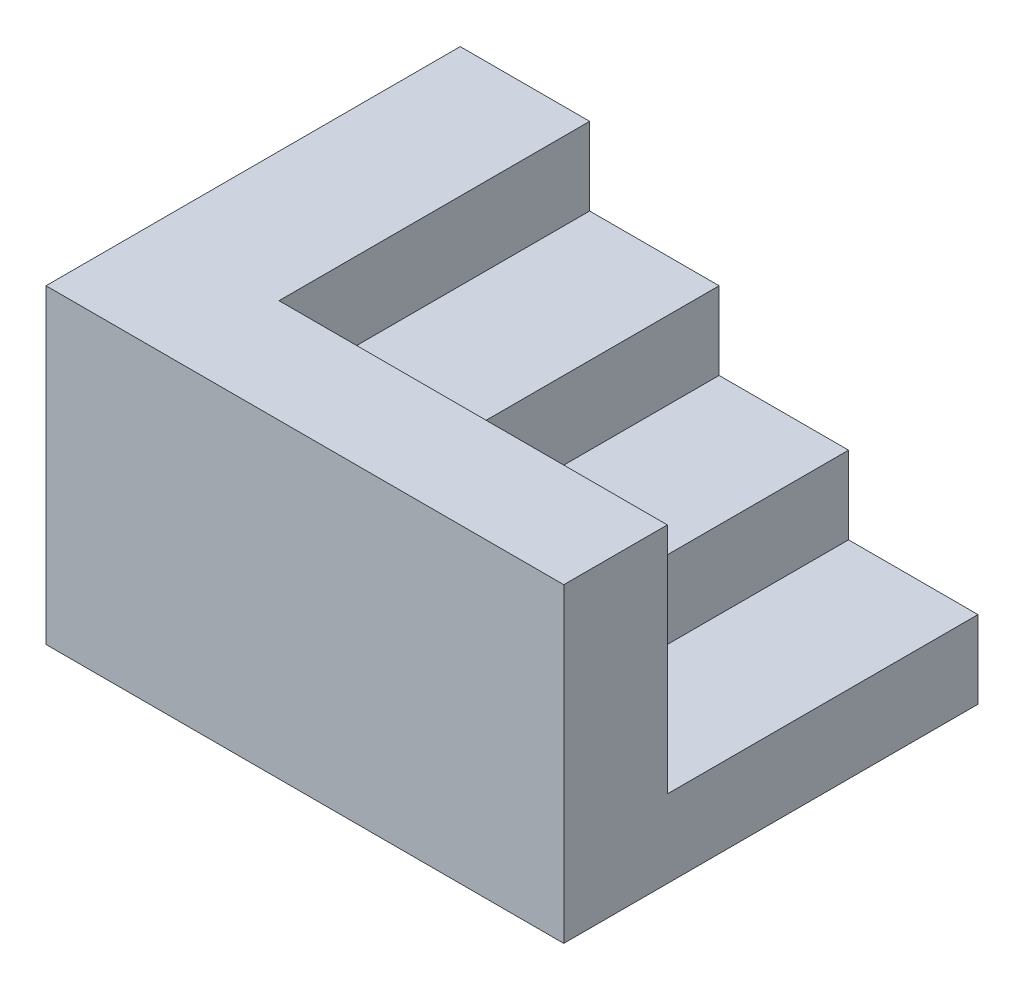
ISO-10303-21;
HEADER;
FILE_DESCRIPTION(('STEP AP214'),'2;1');
FILE_NAME('part.step','',(''),(''),'','','');
FILE_SCHEMA(('AUTOMOTIVE_DESIGN { 1 0 10303 214 1 1 1 1 }'));
ENDSEC;
DATA;
#1=APPLICATION_CONTEXT('core data for automotive mechanical design processes');
#2=APPLICATION_PROTOCOL_DEFINITION('international standard','automotive_design',2000,#1);
#3=PRODUCT_CONTEXT('',#1,'mechanical');
#4=PRODUCT('Part','Part','',(#3));
#5=PRODUCT_RELATED_PRODUCT_CATEGORY('part','',(#4));
#6=PRODUCT_DEFINITION_FORMATION('','',#4);
#7=PRODUCT_DEFINITION_CONTEXT('part definition',#1,'design');
#8=PRODUCT_DEFINITION('design','',#6,#7);
#9=PRODUCT_DEFINITION_SHAPE('','',#8);
#10=(LENGTH_UNIT() NAMED_UNIT(*) SI_UNIT(.MILLI.,.METRE.));
#11=(NAMED_UNIT(*) PLANE_ANGLE_UNIT() SI_UNIT($,.RADIAN.));
#12=(NAMED_UNIT(*) SI_UNIT($,.STERADIAN.) SOLID_ANGLE_UNIT());
#13=UNCERTAINTY_MEASURE_WITH_UNIT(LENGTH_MEASURE(1.E-05),#10,'distance_accuracy_value','');
#14=(GEOMETRIC_REPRESENTATION_CONTEXT(3) GLOBAL_UNCERTAINTY_ASSIGNED_CONTEXT((#13)) GLOBAL_UNIT_ASSIGNED_CONTEXT((#10,
#11,#12)) REPRESENTATION_CONTEXT('',''));
#15=CARTESIAN_POINT('',(0.,0.,0.));
#16=DIRECTION('',(0.,0.,1.));
#17=DIRECTION('',(1.,0.,0.));
#18=AXIS2_PLACEMENT_3D('',#15,#16,#17);
#19=CARTESIAN_POINT('',(-50.,30.,80.));
#20=DIRECTION('',(0.,-1.,0.));
#21=DIRECTION('',(0.,0.,-1.));
#22=AXIS2_PLACEMENT_3D('',#19,#20,#21);
#23=PLANE('',#22);
#24=DIRECTION('',(-1.,0.,0.));
#25=VECTOR('',#24,1.);
#26=CARTESIAN_POINT('',(-50.,30.,0.));
#27=LINE('',#26,#25);
#28=CARTESIAN_POINT('',(-25.,30.,0.));
#29=VERTEX_POINT('',#28);
#30=CARTESIAN_POINT('',(-50.,30.,0.));
#31=VERTEX_POINT('',#30);
#32=EDGE_CURVE('E191',#29,#31,#27,.T.);
#33=ORIENTED_EDGE('',*,*,#32,.T.);
#34=DIRECTION('',(0.,0.,-1.));
#35=VECTOR('',#34,1.);
#36=CARTESIAN_POINT('',(-50.,30.,80.));
#37=LINE('',#36,#35);
#38=CARTESIAN_POINT('',(-50.,30.,80.));
#39=VERTEX_POINT('',#38);
#40=EDGE_CURVE('E200',#39,#31,#37,.T.);
#41=ORIENTED_EDGE('',*,*,#40,.F.);
#42=DIRECTION('',(-1.,0.,0.));
#43=VECTOR('',#42,1.);
#44=CARTESIAN_POINT('',(-50.,30.,80.));
#45=LINE('',#44,#43);
#46=CARTESIAN_POINT('',(50.,30.,80.));
#47=VERTEX_POINT('',#46);
#48=EDGE_CURVE('E197',#47,#39,#45,.T.);
#49=ORIENTED_EDGE('',*,*,#48,.F.);
#50=DIRECTION('',(0.,0.,-1.));
#51=VECTOR('',#50,1.);
#52=CARTESIAN_POINT('',(50.,30.,80.));
#53=LINE('',#52,#51);
#54=CARTESIAN_POINT('',(50.,30.,60.));
#55=VERTEX_POINT('',#54);
#56=EDGE_CURVE('E216',#47,#55,#53,.T.);
#57=ORIENTED_EDGE('',*,*,#56,.T.);
#58=DIRECTION('',(-1.,0.,0.));
#59=VECTOR('',#58,1.);
#60=CARTESIAN_POINT('',(-50.,30.,60.));
#61=LINE('',#60,#59);
#62=CARTESIAN_POINT('',(-25.,30.,60.));
#63=VERTEX_POINT('',#62);
#64=EDGE_CURVE('E69',#55,#63,#61,.T.);
#65=ORIENTED_EDGE('',*,*,#64,.T.);
#66=DIRECTION('',(0.,0.,1.));
#67=VECTOR('',#66,1.);
#68=CARTESIAN_POINT('',(-25.,30.,-176.776695296637));
#69=LINE('',#68,#67);
#70=EDGE_CURVE('E175',#29,#63,#69,.T.);
#71=ORIENTED_EDGE('',*,*,#70,.F.);
#72=EDGE_LOOP('',(#33,#41,#49,#57,#65,#71));
#73=FACE_BOUND('',#72,.T.);
#74=ADVANCED_FACE('F45',(#73),#23,.F.);
#75=CARTESIAN_POINT('',(-50.,30.,80.));
#76=DIRECTION('',(1.,0.,0.));
#77=DIRECTION('',(0.,1.,0.));
#78=AXIS2_PLACEMENT_3D('',#75,#76,#77);
#79=PLANE('',#78);
#80=DIRECTION('',(0.,-1.,0.));
#81=VECTOR('',#80,1.);
#82=CARTESIAN_POINT('',(-50.,30.,0.));
#83=LINE('',#82,#81);
#84=CARTESIAN_POINT('',(-50.,-30.,0.));
#85=VERTEX_POINT('',#84);
#86=EDGE_CURVE('E179',#31,#85,#83,.T.);
#87=ORIENTED_EDGE('',*,*,#86,.T.);
#88=DIRECTION('',(0.,0.,-1.));
#89=VECTOR('',#88,1.);
#90=CARTESIAN_POINT('',(-50.,-30.,80.));
#91=LINE('',#90,#89);
#92=CARTESIAN_POINT('',(-50.,-30.,80.));
#93=VERTEX_POINT('',#92);
#94=EDGE_CURVE('E11',#93,#85,#91,.T.);
#95=ORIENTED_EDGE('',*,*,#94,.F.);
#96=DIRECTION('',(0.,-1.,0.));
#97=VECTOR('',#96,1.);
#98=CARTESIAN_POINT('',(-50.,30.,80.));
#99=LINE('',#98,#97);
#100=EDGE_CURVE('E186',#39,#93,#99,.T.);
#101=ORIENTED_EDGE('',*,*,#100,.F.);
#102=ORIENTED_EDGE('',*,*,#40,.T.);
#103=EDGE_LOOP('',(#87,#95,#101,#102));
#104=FACE_BOUND('',#103,.T.);
#105=ADVANCED_FACE('F47',(#104),#79,.F.);
#106=CARTESIAN_POINT('',(-50.,-30.,80.));
#107=DIRECTION('',(0.,1.,0.));
#108=DIRECTION('',(-1.,0.,0.));
#109=AXIS2_PLACEMENT_3D('',#106,#107,#108);
#110=PLANE('',#109);
#111=DIRECTION('',(1.,0.,0.));
#112=VECTOR('',#111,1.);
#113=CARTESIAN_POINT('',(-50.,-30.,0.));
#114=LINE('',#113,#112);
#115=CARTESIAN_POINT('',(50.,-30.,0.));
#116=VERTEX_POINT('',#115);
#117=EDGE_CURVE('E204',#85,#116,#114,.T.);
#118=ORIENTED_EDGE('',*,*,#117,.T.);
#119=DIRECTION('',(0.,0.,-1.));
#120=VECTOR('',#119,1.);
#121=CARTESIAN_POINT('',(50.,-30.,80.));
#122=LINE('',#121,#120);
#123=CARTESIAN_POINT('',(50.,-30.,80.));
#124=VERTEX_POINT('',#123);
#125=EDGE_CURVE('E54',#124,#116,#122,.T.);
#126=ORIENTED_EDGE('',*,*,#125,.F.);
#127=DIRECTION('',(1.,0.,0.));
#128=VECTOR('',#127,1.);
#129=CARTESIAN_POINT('',(-50.,-30.,80.));
#130=LINE('',#129,#128);
#131=EDGE_CURVE('E190',#93,#124,#130,.T.);
#132=ORIENTED_EDGE('',*,*,#131,.F.);
#133=ORIENTED_EDGE('',*,*,#94,.T.);
#134=EDGE_LOOP('',(#118,#126,#132,#133));
#135=FACE_BOUND('',#134,.T.);
#136=ADVANCED_FACE('F225',(#135),#110,.F.);
#137=CARTESIAN_POINT('',(50.,30.,80.));
#138=DIRECTION('',(-1.,0.,0.));
#139=DIRECTION('',(0.,-1.,0.));
#140=AXIS2_PLACEMENT_3D('',#137,#138,#139);
#141=PLANE('',#140);
#142=DIRECTION('',(0.,1.,0.));
#143=VECTOR('',#142,1.);
#144=CARTESIAN_POINT('',(50.,30.,0.));
#145=LINE('',#144,#143);
#146=CARTESIAN_POINT('',(50.,-15.,0.));
#147=VERTEX_POINT('',#146);
#148=EDGE_CURVE('E208',#116,#147,#145,.T.);
#149=ORIENTED_EDGE('',*,*,#148,.T.);
#150=DIRECTION('',(0.,0.,1.));
#151=VECTOR('',#150,1.);
#152=CARTESIAN_POINT('',(50.,-15.,-176.776695296637));
#153=LINE('',#152,#151);
#154=CARTESIAN_POINT('',(50.,-15.,60.));
#155=VERTEX_POINT('',#154);
#156=EDGE_CURVE('E61',#147,#155,#153,.T.);
#157=ORIENTED_EDGE('',*,*,#156,.T.);
#158=DIRECTION('',(0.,1.,0.));
#159=VECTOR('',#158,1.);
#160=CARTESIAN_POINT('',(50.,30.,60.));
#161=LINE('',#160,#159);
#162=EDGE_CURVE('E182',#155,#55,#161,.T.);
#163=ORIENTED_EDGE('',*,*,#162,.T.);
#164=ORIENTED_EDGE('',*,*,#56,.F.);
#165=DIRECTION('',(0.,1.,0.));
#166=VECTOR('',#165,1.);
#167=CARTESIAN_POINT('',(50.,30.,80.));
#168=LINE('',#167,#166);
#169=EDGE_CURVE('E194',#124,#47,#168,.T.);
#170=ORIENTED_EDGE('',*,*,#169,.F.);
#171=ORIENTED_EDGE('',*,*,#125,.T.);
#172=EDGE_LOOP('',(#149,#157,#163,#164,#170,#171));
#173=FACE_BOUND('',#172,.T.);
#174=ADVANCED_FACE('F221',(#173),#141,.F.);
#175=CARTESIAN_POINT('',(0.,0.,80.));
#176=DIRECTION('',(0.,0.,1.));
#177=DIRECTION('',(1.,0.,0.));
#178=AXIS2_PLACEMENT_3D('',#175,#176,#177);
#179=PLANE('',#178);
#180=ORIENTED_EDGE('',*,*,#100,.T.);
#181=ORIENTED_EDGE('',*,*,#131,.T.);
#182=ORIENTED_EDGE('',*,*,#169,.T.);
#183=ORIENTED_EDGE('',*,*,#48,.T.);
#184=EDGE_LOOP('',(#180,#181,#182,#183));
#185=FACE_BOUND('',#184,.T.);
#186=ADVANCED_FACE('F276',(#185),#179,.T.);
#187=CARTESIAN_POINT('',(0.,0.,0.));
#188=DIRECTION('',(0.,0.,1.));
#189=DIRECTION('',(1.,0.,0.));
#190=AXIS2_PLACEMENT_3D('',#187,#188,#189);
#191=PLANE('',#190);
#192=ORIENTED_EDGE('',*,*,#32,.F.);
#193=DIRECTION('',(0.,-1.,0.));
#194=VECTOR('',#193,1.);
#195=CARTESIAN_POINT('',(-25.,15.,0.));
#196=LINE('',#195,#194);
#197=CARTESIAN_POINT('',(-25.,15.,0.));
#198=VERTEX_POINT('',#197);
#199=EDGE_CURVE('E185',#29,#198,#196,.T.);
#200=ORIENTED_EDGE('',*,*,#199,.T.);
#201=DIRECTION('',(1.,0.,0.));
#202=VECTOR('',#201,1.);
#203=CARTESIAN_POINT('',(0.,15.,0.));
#204=LINE('',#203,#202);
#205=CARTESIAN_POINT('',(0.,15.,0.));
#206=VERTEX_POINT('',#205);
#207=EDGE_CURVE('E252',#198,#206,#204,.T.);
#208=ORIENTED_EDGE('',*,*,#207,.T.);
#209=DIRECTION('',(0.,-1.,0.));
#210=VECTOR('',#209,1.);
#211=CARTESIAN_POINT('',(0.,0.,0.));
#212=LINE('',#211,#210);
#213=CARTESIAN_POINT('',(0.,0.,0.));
#214=VERTEX_POINT('',#213);
#215=EDGE_CURVE('E137',#206,#214,#212,.T.);
#216=ORIENTED_EDGE('',*,*,#215,.T.);
#217=DIRECTION('',(1.,0.,0.));
#218=VECTOR('',#217,1.);
#219=CARTESIAN_POINT('',(25.,0.,0.));
#220=LINE('',#219,#218);
#221=CARTESIAN_POINT('',(25.,0.,0.));
#222=VERTEX_POINT('',#221);
#223=EDGE_CURVE('E130',#214,#222,#220,.T.);
#224=ORIENTED_EDGE('',*,*,#223,.T.);
#225=DIRECTION('',(0.,-1.,0.));
#226=VECTOR('',#225,1.);
#227=CARTESIAN_POINT('',(25.,-15.,0.));
#228=LINE('',#227,#226);
#229=CARTESIAN_POINT('',(25.,-15.,0.));
#230=VERTEX_POINT('',#229);
#231=EDGE_CURVE('E134',#222,#230,#228,.T.);
#232=ORIENTED_EDGE('',*,*,#231,.T.);
#233=DIRECTION('',(1.,0.,0.));
#234=VECTOR('',#233,1.);
#235=CARTESIAN_POINT('',(50.,-15.,0.));
#236=LINE('',#235,#234);
#237=EDGE_CURVE('E153',#230,#147,#236,.T.);
#238=ORIENTED_EDGE('',*,*,#237,.T.);
#239=ORIENTED_EDGE('',*,*,#148,.F.);
#240=ORIENTED_EDGE('',*,*,#117,.F.);
#241=ORIENTED_EDGE('',*,*,#86,.F.);
#242=EDGE_LOOP('',(#192,#200,#208,#216,#224,#232,#238,#239,#240,#241));
#243=FACE_BOUND('',#242,.T.);
#244=ADVANCED_FACE('F133',(#243),#191,.F.);
#245=CARTESIAN_POINT('',(-25.,15.,-176.776695296637));
#246=DIRECTION('',(1.,0.,0.));
#247=DIRECTION('',(0.,1.,0.));
#248=AXIS2_PLACEMENT_3D('',#245,#246,#247);
#249=PLANE('',#248);
#250=ORIENTED_EDGE('',*,*,#199,.F.);
#251=ORIENTED_EDGE('',*,*,#70,.T.);
#252=DIRECTION('',(0.,-1.,0.));
#253=VECTOR('',#252,1.);
#254=CARTESIAN_POINT('',(-25.,15.,60.));
#255=LINE('',#254,#253);
#256=CARTESIAN_POINT('',(-25.,15.,60.));
#257=VERTEX_POINT('',#256);
#258=EDGE_CURVE('E237',#63,#257,#255,.T.);
#259=ORIENTED_EDGE('',*,*,#258,.T.);
#260=DIRECTION('',(0.,0.,1.));
#261=VECTOR('',#260,1.);
#262=CARTESIAN_POINT('',(-25.,15.,-176.776695296637));
#263=LINE('',#262,#261);
#264=EDGE_CURVE('E171',#198,#257,#263,.T.);
#265=ORIENTED_EDGE('',*,*,#264,.F.);
#266=EDGE_LOOP('',(#250,#251,#259,#265));
#267=FACE_BOUND('',#266,.T.);
#268=ADVANCED_FACE('F278',(#267),#249,.T.);
#269=CARTESIAN_POINT('',(0.,15.,-176.776695296637));
#270=DIRECTION('',(0.,1.,0.));
#271=DIRECTION('',(0.,0.,1.));
#272=AXIS2_PLACEMENT_3D('',#269,#270,#271);
#273=PLANE('',#272);
#274=ORIENTED_EDGE('',*,*,#207,.F.);
#275=ORIENTED_EDGE('',*,*,#264,.T.);
#276=DIRECTION('',(1.,0.,0.));
#277=VECTOR('',#276,1.);
#278=CARTESIAN_POINT('',(0.,15.,60.));
#279=LINE('',#278,#277);
#280=CARTESIAN_POINT('',(0.,15.,60.));
#281=VERTEX_POINT('',#280);
#282=EDGE_CURVE('E240',#257,#281,#279,.T.);
#283=ORIENTED_EDGE('',*,*,#282,.T.);
#284=DIRECTION('',(0.,0.,1.));
#285=VECTOR('',#284,1.);
#286=CARTESIAN_POINT('',(0.,15.,-176.776695296637));
#287=LINE('',#286,#285);
#288=EDGE_CURVE('E163',#206,#281,#287,.T.);
#289=ORIENTED_EDGE('',*,*,#288,.F.);
#290=EDGE_LOOP('',(#274,#275,#283,#289));
#291=FACE_BOUND('',#290,.T.);
#292=ADVANCED_FACE('F263',(#291),#273,.T.);
#293=CARTESIAN_POINT('',(0.,0.,-176.776695296637));
#294=DIRECTION('',(1.,0.,0.));
#295=DIRECTION('',(0.,0.,-1.));
#296=AXIS2_PLACEMENT_3D('',#293,#294,#295);
#297=PLANE('',#296);
#298=ORIENTED_EDGE('',*,*,#215,.F.);
#299=ORIENTED_EDGE('',*,*,#288,.T.);
#300=DIRECTION('',(0.,-1.,0.));
#301=VECTOR('',#300,1.);
#302=CARTESIAN_POINT('',(0.,0.,60.));
#303=LINE('',#302,#301);
#304=CARTESIAN_POINT('',(0.,0.,60.));
#305=VERTEX_POINT('',#304);
#306=EDGE_CURVE('E246',#281,#305,#303,.T.);
#307=ORIENTED_EDGE('',*,*,#306,.T.);
#308=DIRECTION('',(0.,0.,1.));
#309=VECTOR('',#308,1.);
#310=CARTESIAN_POINT('',(0.,0.,-176.776695296637));
#311=LINE('',#310,#309);
#312=EDGE_CURVE('E159',#214,#305,#311,.T.);
#313=ORIENTED_EDGE('',*,*,#312,.F.);
#314=EDGE_LOOP('',(#298,#299,#307,#313));
#315=FACE_BOUND('',#314,.T.);
#316=ADVANCED_FACE('F261',(#315),#297,.T.);
#317=CARTESIAN_POINT('',(25.,0.,-176.776695296637));
#318=DIRECTION('',(0.,1.,0.));
#319=DIRECTION('',(0.,0.,1.));
#320=AXIS2_PLACEMENT_3D('',#317,#318,#319);
#321=PLANE('',#320);
#322=ORIENTED_EDGE('',*,*,#223,.F.);
#323=ORIENTED_EDGE('',*,*,#312,.T.);
#324=DIRECTION('',(1.,0.,0.));
#325=VECTOR('',#324,1.);
#326=CARTESIAN_POINT('',(25.,0.,60.));
#327=LINE('',#326,#325);
#328=CARTESIAN_POINT('',(25.,0.,60.));
#329=VERTEX_POINT('',#328);
#330=EDGE_CURVE('E157',#305,#329,#327,.T.);
#331=ORIENTED_EDGE('',*,*,#330,.T.);
#332=DIRECTION('',(0.,0.,1.));
#333=VECTOR('',#332,1.);
#334=CARTESIAN_POINT('',(25.,0.,-176.776695296637));
#335=LINE('',#334,#333);
#336=EDGE_CURVE('E149',#222,#329,#335,.T.);
#337=ORIENTED_EDGE('',*,*,#336,.F.);
#338=EDGE_LOOP('',(#322,#323,#331,#337));
#339=FACE_BOUND('',#338,.T.);
#340=ADVANCED_FACE('F156',(#339),#321,.T.);
#341=CARTESIAN_POINT('',(25.,-15.,-176.776695296637));
#342=DIRECTION('',(1.,0.,0.));
#343=DIRECTION('',(0.,0.,-1.));
#344=AXIS2_PLACEMENT_3D('',#341,#342,#343);
#345=PLANE('',#344);
#346=ORIENTED_EDGE('',*,*,#231,.F.);
#347=ORIENTED_EDGE('',*,*,#336,.T.);
#348=DIRECTION('',(0.,-1.,0.));
#349=VECTOR('',#348,1.);
#350=CARTESIAN_POINT('',(25.,-15.,60.));
#351=LINE('',#350,#349);
#352=CARTESIAN_POINT('',(25.,-15.,60.));
#353=VERTEX_POINT('',#352);
#354=EDGE_CURVE('E234',#329,#353,#351,.T.);
#355=ORIENTED_EDGE('',*,*,#354,.T.);
#356=DIRECTION('',(0.,0.,1.));
#357=VECTOR('',#356,1.);
#358=CARTESIAN_POINT('',(25.,-15.,-176.776695296637));
#359=LINE('',#358,#357);
#360=EDGE_CURVE('E151',#230,#353,#359,.T.);
#361=ORIENTED_EDGE('',*,*,#360,.F.);
#362=EDGE_LOOP('',(#346,#347,#355,#361));
#363=FACE_BOUND('',#362,.T.);
#364=ADVANCED_FACE('F147',(#363),#345,.T.);
#365=CARTESIAN_POINT('',(50.,-15.,-176.776695296637));
#366=DIRECTION('',(0.,1.,0.));
#367=DIRECTION('',(0.,0.,1.));
#368=AXIS2_PLACEMENT_3D('',#365,#366,#367);
#369=PLANE('',#368);
#370=ORIENTED_EDGE('',*,*,#237,.F.);
#371=ORIENTED_EDGE('',*,*,#360,.T.);
#372=DIRECTION('',(1.,0.,0.));
#373=VECTOR('',#372,1.);
#374=CARTESIAN_POINT('',(50.,-15.,60.));
#375=LINE('',#374,#373);
#376=EDGE_CURVE('E230',#353,#155,#375,.T.);
#377=ORIENTED_EDGE('',*,*,#376,.T.);
#378=ORIENTED_EDGE('',*,*,#156,.F.);
#379=EDGE_LOOP('',(#370,#371,#377,#378));
#380=FACE_BOUND('',#379,.T.);
#381=ADVANCED_FACE('F271',(#380),#369,.T.);
#382=CARTESIAN_POINT('',(0.,0.,60.));
#383=DIRECTION('',(0.,0.,1.));
#384=DIRECTION('',(1.,0.,0.));
#385=AXIS2_PLACEMENT_3D('',#382,#383,#384);
#386=PLANE('',#385);
#387=ORIENTED_EDGE('',*,*,#162,.F.);
#388=ORIENTED_EDGE('',*,*,#376,.F.);
#389=ORIENTED_EDGE('',*,*,#354,.F.);
#390=ORIENTED_EDGE('',*,*,#330,.F.);
#391=ORIENTED_EDGE('',*,*,#306,.F.);
#392=ORIENTED_EDGE('',*,*,#282,.F.);
#393=ORIENTED_EDGE('',*,*,#258,.F.);
#394=ORIENTED_EDGE('',*,*,#64,.F.);
#395=EDGE_LOOP('',(#387,#388,#389,#390,#391,#392,#393,#394));
#396=FACE_BOUND('',#395,.T.);
#397=ADVANCED_FACE('F265',(#396),#386,.F.);
#398=CLOSED_SHELL('',(#74,#105,#136,#174,#186,#244,#268,#292,#316,#340,#364,#381,#397));
#399=MANIFOLD_SOLID_BREP('B2',#398);
#400=ADVANCED_BREP_SHAPE_REPRESENTATION('',(#18,#399),#14);
#401=SHAPE_DEFINITION_REPRESENTATION(#9,#400);
ENDSEC;
END-ISO-10303-21;
